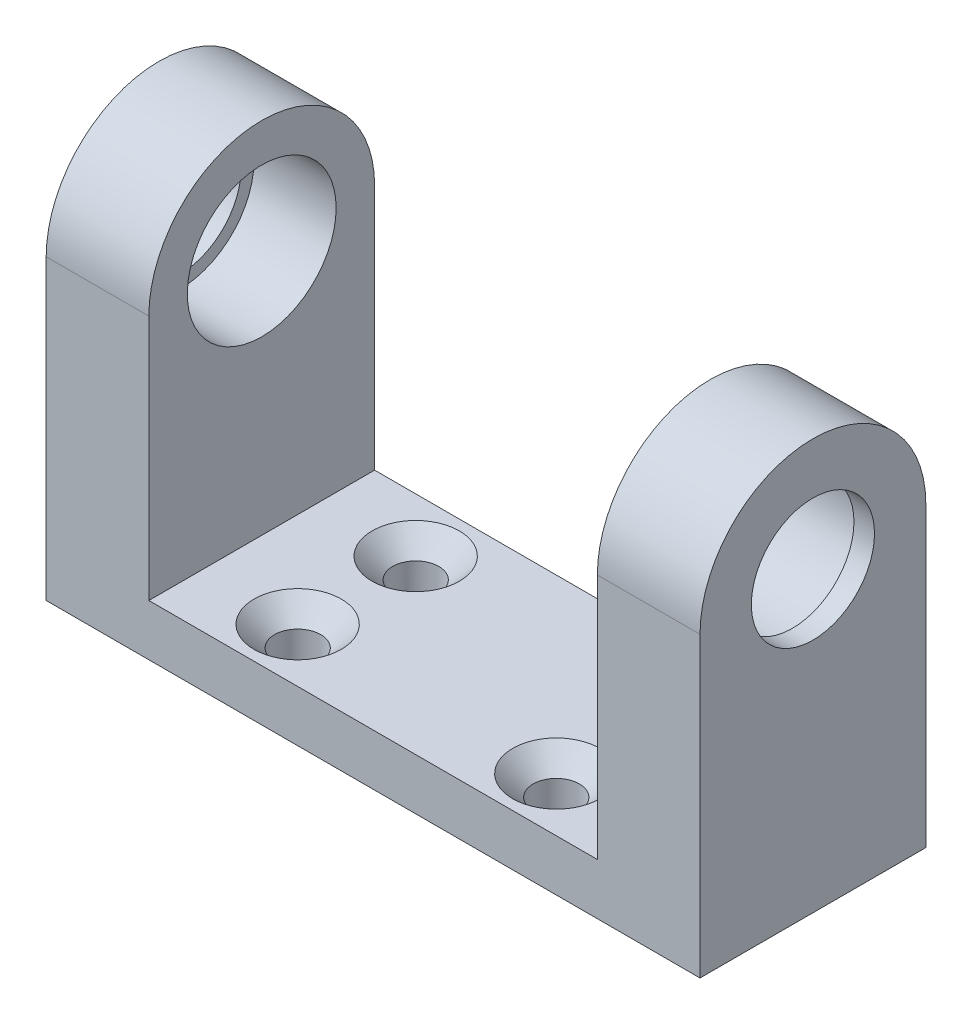
ISO-10303-21;
HEADER;
FILE_DESCRIPTION(('STEP AP214'),'2;1');
FILE_NAME('part.step','',(''),(''),'','','');
FILE_SCHEMA(('AUTOMOTIVE_DESIGN { 1 0 10303 214 1 1 1 1 }'));
ENDSEC;
DATA;
#1=APPLICATION_CONTEXT('core data for automotive mechanical design processes');
#2=APPLICATION_PROTOCOL_DEFINITION('international standard','automotive_design',2000,#1);
#3=PRODUCT_CONTEXT('',#1,'mechanical');
#4=PRODUCT('Part','Part','',(#3));
#5=PRODUCT_RELATED_PRODUCT_CATEGORY('part','',(#4));
#6=PRODUCT_DEFINITION_FORMATION('','',#4);
#7=PRODUCT_DEFINITION_CONTEXT('part definition',#1,'design');
#8=PRODUCT_DEFINITION('design','',#6,#7);
#9=PRODUCT_DEFINITION_SHAPE('','',#8);
#10=(LENGTH_UNIT() NAMED_UNIT(*) SI_UNIT(.MILLI.,.METRE.));
#11=(NAMED_UNIT(*) PLANE_ANGLE_UNIT() SI_UNIT($,.RADIAN.));
#12=(NAMED_UNIT(*) SI_UNIT($,.STERADIAN.) SOLID_ANGLE_UNIT());
#13=UNCERTAINTY_MEASURE_WITH_UNIT(LENGTH_MEASURE(1.E-05),#10,'distance_accuracy_value','');
#14=(GEOMETRIC_REPRESENTATION_CONTEXT(3) GLOBAL_UNCERTAINTY_ASSIGNED_CONTEXT((#13)) GLOBAL_UNIT_ASSIGNED_CONTEXT((#10,
#11,#12)) REPRESENTATION_CONTEXT('',''));
#15=CARTESIAN_POINT('',(0.,0.,0.));
#16=DIRECTION('',(0.,0.,1.));
#17=DIRECTION('',(1.,0.,0.));
#18=AXIS2_PLACEMENT_3D('',#15,#16,#17);
#19=CARTESIAN_POINT('',(-19.25,9.,0.));
#20=DIRECTION('',(1.,0.,0.));
#21=DIRECTION('',(0.,0.,-1.));
#22=AXIS2_PLACEMENT_3D('',#19,#20,#21);
#23=CYLINDRICAL_SURFACE('',#22,6.);
#24=CARTESIAN_POINT('',(-19.25,9.,0.));
#25=DIRECTION('',(1.,0.,0.));
#26=DIRECTION('',(0.,0.,-1.));
#27=AXIS2_PLACEMENT_3D('',#24,#25,#26);
#28=CIRCLE('',#27,6.);
#29=CARTESIAN_POINT('',(-19.25,9.,-6.));
#30=VERTEX_POINT('',#29);
#31=EDGE_CURVE('E233',#30,#30,#28,.T.);
#32=ORIENTED_EDGE('',*,*,#31,.F.);
#33=EDGE_LOOP('',(#32));
#34=FACE_BOUND('',#33,.T.);
#35=CARTESIAN_POINT('',(-17.25,9.,0.));
#36=DIRECTION('',(1.,0.,0.));
#37=DIRECTION('',(0.,0.,-1.));
#38=AXIS2_PLACEMENT_3D('',#35,#36,#37);
#39=CIRCLE('',#38,6.);
#40=CARTESIAN_POINT('',(-17.25,9.,-6.));
#41=VERTEX_POINT('',#40);
#42=EDGE_CURVE('E192',#41,#41,#39,.F.);
#43=ORIENTED_EDGE('',*,*,#42,.F.);
#44=EDGE_LOOP('',(#43));
#45=FACE_BOUND('',#44,.T.);
#46=ADVANCED_FACE('F41',(#34,#45),#23,.F.);
#47=CARTESIAN_POINT('',(0.,0.,11.));
#48=DIRECTION('',(0.,0.,1.));
#49=DIRECTION('',(1.,0.,0.));
#50=AXIS2_PLACEMENT_3D('',#47,#48,#49);
#51=PLANE('',#50);
#52=DIRECTION('',(0.,1.,0.));
#53=VECTOR('',#52,1.);
#54=CARTESIAN_POINT('',(44.45,-20.,11.));
#55=LINE('',#54,#53);
#56=CARTESIAN_POINT('',(44.45,-20.,11.));
#57=VERTEX_POINT('',#56);
#58=CARTESIAN_POINT('',(44.45,9.,11.));
#59=VERTEX_POINT('',#58);
#60=EDGE_CURVE('E138',#57,#59,#55,.T.);
#61=ORIENTED_EDGE('',*,*,#60,.T.);
#62=DIRECTION('',(1.,0.,0.));
#63=VECTOR('',#62,1.);
#64=CARTESIAN_POINT('',(-19.25,9.,11.));
#65=LINE('',#64,#63);
#66=CARTESIAN_POINT('',(34.45,9.,11.));
#67=VERTEX_POINT('',#66);
#68=EDGE_CURVE('E116',#67,#59,#65,.T.);
#69=ORIENTED_EDGE('',*,*,#68,.F.);
#70=DIRECTION('',(0.,-1.,0.));
#71=VECTOR('',#70,1.);
#72=CARTESIAN_POINT('',(34.45,20.,11.));
#73=LINE('',#72,#71);
#74=CARTESIAN_POINT('',(34.45,-15.,11.));
#75=VERTEX_POINT('',#74);
#76=EDGE_CURVE('E249',#67,#75,#73,.T.);
#77=ORIENTED_EDGE('',*,*,#76,.T.);
#78=DIRECTION('',(-1.,0.,0.));
#79=VECTOR('',#78,1.);
#80=CARTESIAN_POINT('',(34.45,-15.,11.));
#81=LINE('',#80,#79);
#82=CARTESIAN_POINT('',(-9.25000000000001,-15.,11.));
#83=VERTEX_POINT('',#82);
#84=EDGE_CURVE('E252',#75,#83,#81,.T.);
#85=ORIENTED_EDGE('',*,*,#84,.T.);
#86=DIRECTION('',(0.,1.,0.));
#87=VECTOR('',#86,1.);
#88=CARTESIAN_POINT('',(-9.25000000000001,-15.,11.));
#89=LINE('',#88,#87);
#90=CARTESIAN_POINT('',(-9.25000000000001,9.,11.));
#91=VERTEX_POINT('',#90);
#92=EDGE_CURVE('E255',#83,#91,#89,.T.);
#93=ORIENTED_EDGE('',*,*,#92,.T.);
#94=CARTESIAN_POINT('',(-19.25,9.,11.));
#95=VERTEX_POINT('',#94);
#96=EDGE_CURVE('E229',#95,#91,#65,.T.);
#97=ORIENTED_EDGE('',*,*,#96,.F.);
#98=DIRECTION('',(0.,-1.,0.));
#99=VECTOR('',#98,1.);
#100=CARTESIAN_POINT('',(-19.25,20.,11.));
#101=LINE('',#100,#99);
#102=CARTESIAN_POINT('',(-19.25,-20.,11.));
#103=VERTEX_POINT('',#102);
#104=EDGE_CURVE('E124',#95,#103,#101,.T.);
#105=ORIENTED_EDGE('',*,*,#104,.T.);
#106=DIRECTION('',(1.,0.,0.));
#107=VECTOR('',#106,1.);
#108=CARTESIAN_POINT('',(-19.25,-20.,11.));
#109=LINE('',#108,#107);
#110=EDGE_CURVE('E132',#103,#57,#109,.T.);
#111=ORIENTED_EDGE('',*,*,#110,.T.);
#112=EDGE_LOOP('',(#61,#69,#77,#85,#93,#97,#105,#111));
#113=FACE_BOUND('',#112,.T.);
#114=ADVANCED_FACE('F281',(#113),#51,.T.);
#115=CARTESIAN_POINT('',(0.,0.,-11.));
#116=DIRECTION('',(0.,0.,1.));
#117=DIRECTION('',(1.,0.,0.));
#118=AXIS2_PLACEMENT_3D('',#115,#116,#117);
#119=PLANE('',#118);
#120=DIRECTION('',(1.,0.,0.));
#121=VECTOR('',#120,1.);
#122=CARTESIAN_POINT('',(-19.25,9.,-11.));
#123=LINE('',#122,#121);
#124=CARTESIAN_POINT('',(44.45,8.99999999999999,-11.));
#125=VERTEX_POINT('',#124);
#126=CARTESIAN_POINT('',(34.45,9.,-11.));
#127=VERTEX_POINT('',#126);
#128=EDGE_CURVE('E159',#125,#127,#123,.F.);
#129=ORIENTED_EDGE('',*,*,#128,.F.);
#130=DIRECTION('',(0.,1.,0.));
#131=VECTOR('',#130,1.);
#132=CARTESIAN_POINT('',(44.45,-20.,-11.));
#133=LINE('',#132,#131);
#134=CARTESIAN_POINT('',(44.45,-20.,-11.));
#135=VERTEX_POINT('',#134);
#136=EDGE_CURVE('E263',#135,#125,#133,.T.);
#137=ORIENTED_EDGE('',*,*,#136,.F.);
#138=DIRECTION('',(1.,0.,0.));
#139=VECTOR('',#138,1.);
#140=CARTESIAN_POINT('',(-19.25,-20.,-11.));
#141=LINE('',#140,#139);
#142=CARTESIAN_POINT('',(-19.25,-20.,-11.));
#143=VERTEX_POINT('',#142);
#144=EDGE_CURVE('E130',#143,#135,#141,.T.);
#145=ORIENTED_EDGE('',*,*,#144,.F.);
#146=DIRECTION('',(0.,-1.,0.));
#147=VECTOR('',#146,1.);
#148=CARTESIAN_POINT('',(-19.25,20.,-11.));
#149=LINE('',#148,#147);
#150=CARTESIAN_POINT('',(-19.25,9.,-11.));
#151=VERTEX_POINT('',#150);
#152=EDGE_CURVE('E122',#151,#143,#149,.T.);
#153=ORIENTED_EDGE('',*,*,#152,.F.);
#154=DIRECTION('',(1.,0.,0.));
#155=VECTOR('',#154,1.);
#156=CARTESIAN_POINT('',(-19.25,9.,-11.));
#157=LINE('',#156,#155);
#158=CARTESIAN_POINT('',(-9.25000000000001,9.,-11.));
#159=VERTEX_POINT('',#158);
#160=EDGE_CURVE('E106',#151,#159,#157,.T.);
#161=ORIENTED_EDGE('',*,*,#160,.T.);
#162=DIRECTION('',(0.,1.,0.));
#163=VECTOR('',#162,1.);
#164=CARTESIAN_POINT('',(-9.25000000000001,-15.,-11.));
#165=LINE('',#164,#163);
#166=CARTESIAN_POINT('',(-9.25000000000001,-15.,-11.));
#167=VERTEX_POINT('',#166);
#168=EDGE_CURVE('E133',#167,#159,#165,.T.);
#169=ORIENTED_EDGE('',*,*,#168,.F.);
#170=DIRECTION('',(-1.,0.,0.));
#171=VECTOR('',#170,1.);
#172=CARTESIAN_POINT('',(34.45,-15.,-11.));
#173=LINE('',#172,#171);
#174=CARTESIAN_POINT('',(34.45,-15.,-11.));
#175=VERTEX_POINT('',#174);
#176=EDGE_CURVE('E140',#175,#167,#173,.T.);
#177=ORIENTED_EDGE('',*,*,#176,.F.);
#178=DIRECTION('',(0.,-1.,0.));
#179=VECTOR('',#178,1.);
#180=CARTESIAN_POINT('',(34.45,20.,-11.));
#181=LINE('',#180,#179);
#182=EDGE_CURVE('E267',#127,#175,#181,.T.);
#183=ORIENTED_EDGE('',*,*,#182,.F.);
#184=EDGE_LOOP('',(#129,#137,#145,#153,#161,#169,#177,#183));
#185=FACE_BOUND('',#184,.T.);
#186=ADVANCED_FACE('F128',(#185),#119,.F.);
#187=CARTESIAN_POINT('',(-19.25,-20.,11.));
#188=DIRECTION('',(0.,1.,0.));
#189=DIRECTION('',(0.,0.,1.));
#190=AXIS2_PLACEMENT_3D('',#187,#188,#189);
#191=PLANE('',#190);
#192=CARTESIAN_POINT('',(0.,-20.,5.75));
#193=DIRECTION('',(0.,1.,0.));
#194=DIRECTION('',(0.,0.,1.));
#195=AXIS2_PLACEMENT_3D('',#192,#193,#194);
#196=CIRCLE('',#195,2.25);
#197=CARTESIAN_POINT('',(0.,-20.,8.));
#198=VERTEX_POINT('',#197);
#199=EDGE_CURVE('E216',#198,#198,#196,.T.);
#200=ORIENTED_EDGE('',*,*,#199,.T.);
#201=EDGE_LOOP('',(#200));
#202=FACE_BOUND('',#201,.T.);
#203=CARTESIAN_POINT('',(25.2,-20.,-5.75));
#204=DIRECTION('',(0.,1.,0.));
#205=DIRECTION('',(0.,0.,1.));
#206=AXIS2_PLACEMENT_3D('',#203,#204,#205);
#207=CIRCLE('',#206,2.25);
#208=CARTESIAN_POINT('',(25.2,-20.,-3.5));
#209=VERTEX_POINT('',#208);
#210=EDGE_CURVE('E211',#209,#209,#207,.T.);
#211=ORIENTED_EDGE('',*,*,#210,.T.);
#212=EDGE_LOOP('',(#211));
#213=FACE_BOUND('',#212,.T.);
#214=CARTESIAN_POINT('',(25.2,-20.,5.75));
#215=DIRECTION('',(0.,1.,0.));
#216=DIRECTION('',(0.,0.,1.));
#217=AXIS2_PLACEMENT_3D('',#214,#215,#216);
#218=CIRCLE('',#217,2.25);
#219=CARTESIAN_POINT('',(25.2,-20.,8.));
#220=VERTEX_POINT('',#219);
#221=EDGE_CURVE('E205',#220,#220,#218,.T.);
#222=ORIENTED_EDGE('',*,*,#221,.T.);
#223=EDGE_LOOP('',(#222));
#224=FACE_BOUND('',#223,.T.);
#225=CARTESIAN_POINT('',(0.,-20.,-5.75));
#226=DIRECTION('',(0.,1.,0.));
#227=DIRECTION('',(0.,0.,1.));
#228=AXIS2_PLACEMENT_3D('',#225,#226,#227);
#229=CIRCLE('',#228,2.25);
#230=CARTESIAN_POINT('',(0.,-20.,-3.5));
#231=VERTEX_POINT('',#230);
#232=EDGE_CURVE('E220',#231,#231,#229,.T.);
#233=ORIENTED_EDGE('',*,*,#232,.T.);
#234=EDGE_LOOP('',(#233));
#235=FACE_BOUND('',#234,.T.);
#236=ORIENTED_EDGE('',*,*,#144,.T.);
#237=DIRECTION('',(0.,0.,-1.));
#238=VECTOR('',#237,1.);
#239=CARTESIAN_POINT('',(44.45,-20.,11.));
#240=LINE('',#239,#238);
#241=EDGE_CURVE('E155',#57,#135,#240,.T.);
#242=ORIENTED_EDGE('',*,*,#241,.F.);
#243=ORIENTED_EDGE('',*,*,#110,.F.);
#244=DIRECTION('',(0.,0.,-1.));
#245=VECTOR('',#244,1.);
#246=CARTESIAN_POINT('',(-19.25,-20.,11.));
#247=LINE('',#246,#245);
#248=EDGE_CURVE('E144',#103,#143,#247,.T.);
#249=ORIENTED_EDGE('',*,*,#248,.T.);
#250=EDGE_LOOP('',(#236,#242,#243,#249));
#251=FACE_BOUND('',#250,.T.);
#252=ADVANCED_FACE('F291',(#202,#213,#224,#235,#251),#191,.F.);
#253=CARTESIAN_POINT('',(44.45,-20.,11.));
#254=DIRECTION('',(-1.,0.,0.));
#255=DIRECTION('',(0.,0.,1.));
#256=AXIS2_PLACEMENT_3D('',#253,#254,#255);
#257=PLANE('',#256);
#258=CARTESIAN_POINT('',(44.45,9.,0.));
#259=DIRECTION('',(1.,0.,0.));
#260=DIRECTION('',(0.,0.,-1.));
#261=AXIS2_PLACEMENT_3D('',#258,#259,#260);
#262=CIRCLE('',#261,6.);
#263=CARTESIAN_POINT('',(44.45,9.,-6.));
#264=VERTEX_POINT('',#263);
#265=EDGE_CURVE('E231',#264,#264,#262,.T.);
#266=ORIENTED_EDGE('',*,*,#265,.F.);
#267=EDGE_LOOP('',(#266));
#268=FACE_BOUND('',#267,.T.);
#269=ORIENTED_EDGE('',*,*,#136,.T.);
#270=CARTESIAN_POINT('',(44.45,9.,0.));
#271=DIRECTION('',(-1.,0.,0.));
#272=DIRECTION('',(0.,0.,-1.));
#273=AXIS2_PLACEMENT_3D('',#270,#271,#272);
#274=CIRCLE('',#273,11.);
#275=EDGE_CURVE('E59',#59,#125,#274,.T.);
#276=ORIENTED_EDGE('',*,*,#275,.F.);
#277=ORIENTED_EDGE('',*,*,#60,.F.);
#278=ORIENTED_EDGE('',*,*,#241,.T.);
#279=EDGE_LOOP('',(#269,#276,#277,#278));
#280=FACE_BOUND('',#279,.T.);
#281=ADVANCED_FACE('F287',(#268,#280),#257,.F.);
#282=CARTESIAN_POINT('',(34.45,20.,11.));
#283=DIRECTION('',(1.,0.,0.));
#284=DIRECTION('',(0.,0.,-1.));
#285=AXIS2_PLACEMENT_3D('',#282,#283,#284);
#286=PLANE('',#285);
#287=CARTESIAN_POINT('',(34.45,9.,0.));
#288=DIRECTION('',(1.,0.,0.));
#289=DIRECTION('',(0.,0.,-1.));
#290=AXIS2_PLACEMENT_3D('',#287,#288,#289);
#291=CIRCLE('',#290,7.25);
#292=CARTESIAN_POINT('',(34.45,9.,-7.25));
#293=VERTEX_POINT('',#292);
#294=EDGE_CURVE('E200',#293,#293,#291,.T.);
#295=ORIENTED_EDGE('',*,*,#294,.T.);
#296=EDGE_LOOP('',(#295));
#297=FACE_BOUND('',#296,.T.);
#298=ORIENTED_EDGE('',*,*,#76,.F.);
#299=CARTESIAN_POINT('',(34.45,9.,0.));
#300=DIRECTION('',(1.,0.,0.));
#301=DIRECTION('',(0.,0.,-1.));
#302=AXIS2_PLACEMENT_3D('',#299,#300,#301);
#303=CIRCLE('',#302,11.);
#304=EDGE_CURVE('E242',#67,#127,#303,.F.);
#305=ORIENTED_EDGE('',*,*,#304,.T.);
#306=ORIENTED_EDGE('',*,*,#182,.T.);
#307=DIRECTION('',(0.,0.,-1.));
#308=VECTOR('',#307,1.);
#309=CARTESIAN_POINT('',(34.45,-15.,11.));
#310=LINE('',#309,#308);
#311=EDGE_CURVE('E151',#75,#175,#310,.T.);
#312=ORIENTED_EDGE('',*,*,#311,.F.);
#313=EDGE_LOOP('',(#298,#305,#306,#312));
#314=FACE_BOUND('',#313,.T.);
#315=ADVANCED_FACE('F285',(#297,#314),#286,.F.);
#316=CARTESIAN_POINT('',(34.45,-15.,11.));
#317=DIRECTION('',(0.,-1.,0.));
#318=DIRECTION('',(1.,0.,0.));
#319=AXIS2_PLACEMENT_3D('',#316,#317,#318);
#320=PLANE('',#319);
#321=CARTESIAN_POINT('',(25.2,-15.,-5.75));
#322=DIRECTION('',(0.,-1.,0.));
#323=DIRECTION('',(1.,0.,0.));
#324=AXIS2_PLACEMENT_3D('',#321,#322,#323);
#325=CIRCLE('',#324,4.25);
#326=CARTESIAN_POINT('',(29.45,-15.,-5.75));
#327=VERTEX_POINT('',#326);
#328=EDGE_CURVE('E178',#327,#327,#325,.T.);
#329=ORIENTED_EDGE('',*,*,#328,.T.);
#330=EDGE_LOOP('',(#329));
#331=FACE_BOUND('',#330,.T.);
#332=CARTESIAN_POINT('',(25.2,-15.,5.75));
#333=DIRECTION('',(0.,-1.,0.));
#334=DIRECTION('',(1.,0.,0.));
#335=AXIS2_PLACEMENT_3D('',#332,#333,#334);
#336=CIRCLE('',#335,4.25);
#337=CARTESIAN_POINT('',(29.45,-15.,5.75));
#338=VERTEX_POINT('',#337);
#339=EDGE_CURVE('E174',#338,#338,#336,.T.);
#340=ORIENTED_EDGE('',*,*,#339,.T.);
#341=EDGE_LOOP('',(#340));
#342=FACE_BOUND('',#341,.T.);
#343=CARTESIAN_POINT('',(0.,-15.,-5.75));
#344=DIRECTION('',(0.,-1.,0.));
#345=DIRECTION('',(1.,0.,0.));
#346=AXIS2_PLACEMENT_3D('',#343,#344,#345);
#347=CIRCLE('',#346,4.25000000000001);
#348=CARTESIAN_POINT('',(4.25000000000001,-15.,-5.75));
#349=VERTEX_POINT('',#348);
#350=EDGE_CURVE('E170',#349,#349,#347,.T.);
#351=ORIENTED_EDGE('',*,*,#350,.T.);
#352=EDGE_LOOP('',(#351));
#353=FACE_BOUND('',#352,.T.);
#354=CARTESIAN_POINT('',(0.,-15.,5.75));
#355=DIRECTION('',(0.,-1.,0.));
#356=DIRECTION('',(1.,0.,0.));
#357=AXIS2_PLACEMENT_3D('',#354,#355,#356);
#358=CIRCLE('',#357,4.25000000000002);
#359=CARTESIAN_POINT('',(4.25000000000002,-15.,5.75));
#360=VERTEX_POINT('',#359);
#361=EDGE_CURVE('E166',#360,#360,#358,.T.);
#362=ORIENTED_EDGE('',*,*,#361,.T.);
#363=EDGE_LOOP('',(#362));
#364=FACE_BOUND('',#363,.T.);
#365=ORIENTED_EDGE('',*,*,#176,.T.);
#366=DIRECTION('',(0.,0.,-1.));
#367=VECTOR('',#366,1.);
#368=CARTESIAN_POINT('',(-9.25000000000001,-15.,11.));
#369=LINE('',#368,#367);
#370=EDGE_CURVE('E147',#83,#167,#369,.T.);
#371=ORIENTED_EDGE('',*,*,#370,.F.);
#372=ORIENTED_EDGE('',*,*,#84,.F.);
#373=ORIENTED_EDGE('',*,*,#311,.T.);
#374=EDGE_LOOP('',(#365,#371,#372,#373));
#375=FACE_BOUND('',#374,.T.);
#376=ADVANCED_FACE('F273',(#331,#342,#353,#364,#375),#320,.F.);
#377=CARTESIAN_POINT('',(-9.25000000000001,-15.,11.));
#378=DIRECTION('',(-1.,0.,0.));
#379=DIRECTION('',(0.,-1.,0.));
#380=AXIS2_PLACEMENT_3D('',#377,#378,#379);
#381=PLANE('',#380);
#382=CARTESIAN_POINT('',(-9.25000000000001,9.,0.));
#383=DIRECTION('',(-1.,0.,0.));
#384=DIRECTION('',(0.,-1.,0.));
#385=AXIS2_PLACEMENT_3D('',#382,#383,#384);
#386=CIRCLE('',#385,7.25);
#387=CARTESIAN_POINT('',(-9.25000000000001,1.75,0.));
#388=VERTEX_POINT('',#387);
#389=EDGE_CURVE('E45',#388,#388,#386,.T.);
#390=ORIENTED_EDGE('',*,*,#389,.T.);
#391=EDGE_LOOP('',(#390));
#392=FACE_BOUND('',#391,.T.);
#393=ORIENTED_EDGE('',*,*,#168,.T.);
#394=CARTESIAN_POINT('',(-9.25000000000001,9.,0.));
#395=DIRECTION('',(-1.,0.,0.));
#396=DIRECTION('',(0.,-1.,0.));
#397=AXIS2_PLACEMENT_3D('',#394,#395,#396);
#398=CIRCLE('',#397,11.);
#399=EDGE_CURVE('E67',#159,#91,#398,.F.);
#400=ORIENTED_EDGE('',*,*,#399,.T.);
#401=ORIENTED_EDGE('',*,*,#92,.F.);
#402=ORIENTED_EDGE('',*,*,#370,.T.);
#403=EDGE_LOOP('',(#393,#400,#401,#402));
#404=FACE_BOUND('',#403,.T.);
#405=ADVANCED_FACE('F279',(#392,#404),#381,.F.);
#406=CARTESIAN_POINT('',(-19.25,20.,11.));
#407=DIRECTION('',(1.,0.,0.));
#408=DIRECTION('',(0.,0.,-1.));
#409=AXIS2_PLACEMENT_3D('',#406,#407,#408);
#410=PLANE('',#409);
#411=ORIENTED_EDGE('',*,*,#31,.T.);
#412=EDGE_LOOP('',(#411));
#413=FACE_BOUND('',#412,.T.);
#414=ORIENTED_EDGE('',*,*,#104,.F.);
#415=CARTESIAN_POINT('',(-19.25,9.,0.));
#416=DIRECTION('',(-1.,0.,0.));
#417=DIRECTION('',(0.,0.,1.));
#418=AXIS2_PLACEMENT_3D('',#415,#416,#417);
#419=CIRCLE('',#418,11.);
#420=EDGE_CURVE('E109',#95,#151,#419,.T.);
#421=ORIENTED_EDGE('',*,*,#420,.T.);
#422=ORIENTED_EDGE('',*,*,#152,.T.);
#423=ORIENTED_EDGE('',*,*,#248,.F.);
#424=EDGE_LOOP('',(#414,#421,#422,#423));
#425=FACE_BOUND('',#424,.T.);
#426=ADVANCED_FACE('F120',(#413,#425),#410,.F.);
#427=CARTESIAN_POINT('',(-19.25,9.,0.));
#428=DIRECTION('',(1.,0.,0.));
#429=DIRECTION('',(0.,0.,-1.));
#430=AXIS2_PLACEMENT_3D('',#427,#428,#429);
#431=CYLINDRICAL_SURFACE('',#430,11.);
#432=ORIENTED_EDGE('',*,*,#160,.F.);
#433=ORIENTED_EDGE('',*,*,#420,.F.);
#434=ORIENTED_EDGE('',*,*,#96,.T.);
#435=ORIENTED_EDGE('',*,*,#399,.F.);
#436=EDGE_LOOP('',(#432,#433,#434,#435));
#437=FACE_BOUND('',#436,.T.);
#438=ADVANCED_FACE('F108',(#437),#431,.T.);
#439=ORIENTED_EDGE('',*,*,#275,.T.);
#440=ORIENTED_EDGE('',*,*,#128,.T.);
#441=ORIENTED_EDGE('',*,*,#304,.F.);
#442=ORIENTED_EDGE('',*,*,#68,.T.);
#443=EDGE_LOOP('',(#439,#440,#441,#442));
#444=FACE_BOUND('',#443,.T.);
#445=ADVANCED_FACE('F317',(#444),#431,.T.);
#446=CARTESIAN_POINT('',(42.45,9.,0.));
#447=DIRECTION('',(1.,0.,0.));
#448=DIRECTION('',(0.,0.,-1.));
#449=AXIS2_PLACEMENT_3D('',#446,#447,#448);
#450=CIRCLE('',#449,6.);
#451=CARTESIAN_POINT('',(42.45,9.,-6.));
#452=VERTEX_POINT('',#451);
#453=EDGE_CURVE('E189',#452,#452,#450,.F.);
#454=ORIENTED_EDGE('',*,*,#453,.T.);
#455=EDGE_LOOP('',(#454));
#456=FACE_BOUND('',#455,.T.);
#457=ORIENTED_EDGE('',*,*,#265,.T.);
#458=EDGE_LOOP('',(#457));
#459=FACE_BOUND('',#458,.T.);
#460=ADVANCED_FACE('F307',(#456,#459),#23,.F.);
#461=CARTESIAN_POINT('',(0.,-20.,-5.75));
#462=DIRECTION('',(0.,1.,0.));
#463=DIRECTION('',(0.,0.,1.));
#464=AXIS2_PLACEMENT_3D('',#461,#462,#463);
#465=CYLINDRICAL_SURFACE('',#464,2.25);
#466=CARTESIAN_POINT('',(0.,-17.,-5.75));
#467=DIRECTION('',(0.,-1.,0.));
#468=DIRECTION('',(0.,0.,-1.));
#469=AXIS2_PLACEMENT_3D('',#466,#467,#468);
#470=CIRCLE('',#469,2.25);
#471=CARTESIAN_POINT('',(0.,-17.,-8.));
#472=VERTEX_POINT('',#471);
#473=EDGE_CURVE('E51',#472,#472,#470,.F.);
#474=ORIENTED_EDGE('',*,*,#473,.T.);
#475=EDGE_LOOP('',(#474));
#476=FACE_BOUND('',#475,.T.);
#477=ORIENTED_EDGE('',*,*,#232,.F.);
#478=EDGE_LOOP('',(#477));
#479=FACE_BOUND('',#478,.T.);
#480=ADVANCED_FACE('F316',(#476,#479),#465,.F.);
#481=CARTESIAN_POINT('',(25.2,-20.,5.75));
#482=DIRECTION('',(0.,1.,0.));
#483=DIRECTION('',(0.,0.,1.));
#484=AXIS2_PLACEMENT_3D('',#481,#482,#483);
#485=CYLINDRICAL_SURFACE('',#484,2.25);
#486=CARTESIAN_POINT('',(25.2,-17.,5.75));
#487=DIRECTION('',(0.,-1.,0.));
#488=DIRECTION('',(0.,0.,-1.));
#489=AXIS2_PLACEMENT_3D('',#486,#487,#488);
#490=CIRCLE('',#489,2.25);
#491=CARTESIAN_POINT('',(25.2,-17.,3.5));
#492=VERTEX_POINT('',#491);
#493=EDGE_CURVE('E182',#492,#492,#490,.F.);
#494=ORIENTED_EDGE('',*,*,#493,.T.);
#495=EDGE_LOOP('',(#494));
#496=FACE_BOUND('',#495,.T.);
#497=ORIENTED_EDGE('',*,*,#221,.F.);
#498=EDGE_LOOP('',(#497));
#499=FACE_BOUND('',#498,.T.);
#500=ADVANCED_FACE('F323',(#496,#499),#485,.F.);
#501=CARTESIAN_POINT('',(25.2,-20.,-5.75));
#502=DIRECTION('',(0.,1.,0.));
#503=DIRECTION('',(0.,0.,1.));
#504=AXIS2_PLACEMENT_3D('',#501,#502,#503);
#505=CYLINDRICAL_SURFACE('',#504,2.25);
#506=CARTESIAN_POINT('',(25.2,-17.,-5.75));
#507=DIRECTION('',(0.,-1.,0.));
#508=DIRECTION('',(0.,0.,-1.));
#509=AXIS2_PLACEMENT_3D('',#506,#507,#508);
#510=CIRCLE('',#509,2.25);
#511=CARTESIAN_POINT('',(25.2,-17.,-8.));
#512=VERTEX_POINT('',#511);
#513=EDGE_CURVE('E162',#512,#512,#510,.F.);
#514=ORIENTED_EDGE('',*,*,#513,.T.);
#515=EDGE_LOOP('',(#514));
#516=FACE_BOUND('',#515,.T.);
#517=ORIENTED_EDGE('',*,*,#210,.F.);
#518=EDGE_LOOP('',(#517));
#519=FACE_BOUND('',#518,.T.);
#520=ADVANCED_FACE('F350',(#516,#519),#505,.F.);
#521=CARTESIAN_POINT('',(0.,-20.,5.75));
#522=DIRECTION('',(0.,1.,0.));
#523=DIRECTION('',(0.,0.,1.));
#524=AXIS2_PLACEMENT_3D('',#521,#522,#523);
#525=CYLINDRICAL_SURFACE('',#524,2.25);
#526=CARTESIAN_POINT('',(0.,-17.,5.75));
#527=DIRECTION('',(0.,-1.,0.));
#528=DIRECTION('',(0.,0.,-1.));
#529=AXIS2_PLACEMENT_3D('',#526,#527,#528);
#530=CIRCLE('',#529,2.25);
#531=CARTESIAN_POINT('',(0.,-17.,3.5));
#532=VERTEX_POINT('',#531);
#533=EDGE_CURVE('E12',#532,#532,#530,.F.);
#534=ORIENTED_EDGE('',*,*,#533,.T.);
#535=EDGE_LOOP('',(#534));
#536=FACE_BOUND('',#535,.T.);
#537=ORIENTED_EDGE('',*,*,#199,.F.);
#538=EDGE_LOOP('',(#537));
#539=FACE_BOUND('',#538,.T.);
#540=ADVANCED_FACE('F352',(#536,#539),#525,.F.);
#541=CARTESIAN_POINT('',(25.2,-17.,-5.75));
#542=DIRECTION('',(0.,1.,0.));
#543=DIRECTION('',(0.,0.,1.));
#544=AXIS2_PLACEMENT_3D('',#541,#542,#543);
#545=CONICAL_SURFACE('',#544,2.25,0.78539816339745);
#546=ORIENTED_EDGE('',*,*,#328,.F.);
#547=EDGE_LOOP('',(#546));
#548=FACE_BOUND('',#547,.T.);
#549=ORIENTED_EDGE('',*,*,#513,.F.);
#550=EDGE_LOOP('',(#549));
#551=FACE_BOUND('',#550,.T.);
#552=ADVANCED_FACE('F355',(#548,#551),#545,.F.);
#553=CARTESIAN_POINT('',(25.2,-17.,5.75));
#554=DIRECTION('',(0.,1.,0.));
#555=DIRECTION('',(0.,0.,1.));
#556=AXIS2_PLACEMENT_3D('',#553,#554,#555);
#557=CONICAL_SURFACE('',#556,2.25,0.78539816339745);
#558=ORIENTED_EDGE('',*,*,#339,.F.);
#559=EDGE_LOOP('',(#558));
#560=FACE_BOUND('',#559,.T.);
#561=ORIENTED_EDGE('',*,*,#493,.F.);
#562=EDGE_LOOP('',(#561));
#563=FACE_BOUND('',#562,.T.);
#564=ADVANCED_FACE('F372',(#560,#563),#557,.F.);
#565=CARTESIAN_POINT('',(0.,-17.,-5.75));
#566=DIRECTION('',(0.,1.,0.));
#567=DIRECTION('',(0.,0.,1.));
#568=AXIS2_PLACEMENT_3D('',#565,#566,#567);
#569=CONICAL_SURFACE('',#568,2.25,0.78539816339745);
#570=ORIENTED_EDGE('',*,*,#350,.F.);
#571=EDGE_LOOP('',(#570));
#572=FACE_BOUND('',#571,.T.);
#573=ORIENTED_EDGE('',*,*,#473,.F.);
#574=EDGE_LOOP('',(#573));
#575=FACE_BOUND('',#574,.T.);
#576=ADVANCED_FACE('F342',(#572,#575),#569,.F.);
#577=CARTESIAN_POINT('',(0.,-17.,5.75));
#578=DIRECTION('',(0.,1.,0.));
#579=DIRECTION('',(0.,0.,1.));
#580=AXIS2_PLACEMENT_3D('',#577,#578,#579);
#581=CONICAL_SURFACE('',#580,2.25,0.78539816339745);
#582=ORIENTED_EDGE('',*,*,#361,.F.);
#583=EDGE_LOOP('',(#582));
#584=FACE_BOUND('',#583,.T.);
#585=ORIENTED_EDGE('',*,*,#533,.F.);
#586=EDGE_LOOP('',(#585));
#587=FACE_BOUND('',#586,.T.);
#588=ADVANCED_FACE('F43',(#584,#587),#581,.F.);
#589=CARTESIAN_POINT('',(42.45,9.,0.));
#590=DIRECTION('',(1.,0.,0.));
#591=DIRECTION('',(0.,0.,-1.));
#592=AXIS2_PLACEMENT_3D('',#589,#590,#591);
#593=PLANE('',#592);
#594=CARTESIAN_POINT('',(42.45,9.,0.));
#595=DIRECTION('',(1.,0.,0.));
#596=DIRECTION('',(0.,0.,-1.));
#597=AXIS2_PLACEMENT_3D('',#594,#595,#596);
#598=CIRCLE('',#597,7.25);
#599=CARTESIAN_POINT('',(42.45,9.,-7.25));
#600=VERTEX_POINT('',#599);
#601=EDGE_CURVE('E522',#600,#600,#598,.T.);
#602=ORIENTED_EDGE('',*,*,#601,.F.);
#603=EDGE_LOOP('',(#602));
#604=FACE_BOUND('',#603,.T.);
#605=ORIENTED_EDGE('',*,*,#453,.F.);
#606=EDGE_LOOP('',(#605));
#607=FACE_BOUND('',#606,.T.);
#608=ADVANCED_FACE('F330',(#604,#607),#593,.F.);
#609=CARTESIAN_POINT('',(-39.7560966544099,9.,0.));
#610=DIRECTION('',(1.,0.,0.));
#611=DIRECTION('',(0.,0.,-1.));
#612=AXIS2_PLACEMENT_3D('',#609,#610,#611);
#613=CYLINDRICAL_SURFACE('',#612,7.25);
#614=ORIENTED_EDGE('',*,*,#601,.T.);
#615=EDGE_LOOP('',(#614));
#616=FACE_BOUND('',#615,.T.);
#617=ORIENTED_EDGE('',*,*,#294,.F.);
#618=EDGE_LOOP('',(#617));
#619=FACE_BOUND('',#618,.T.);
#620=ADVANCED_FACE('F332',(#616,#619),#613,.F.);
#621=CARTESIAN_POINT('',(-17.25,9.,0.));
#622=DIRECTION('',(1.,0.,0.));
#623=DIRECTION('',(0.,0.,-1.));
#624=AXIS2_PLACEMENT_3D('',#621,#622,#623);
#625=CIRCLE('',#624,7.25);
#626=CARTESIAN_POINT('',(-17.25,9.,-7.25));
#627=VERTEX_POINT('',#626);
#628=EDGE_CURVE('E193',#627,#627,#625,.F.);
#629=ORIENTED_EDGE('',*,*,#628,.T.);
#630=EDGE_LOOP('',(#629));
#631=FACE_BOUND('',#630,.T.);
#632=ORIENTED_EDGE('',*,*,#389,.F.);
#633=EDGE_LOOP('',(#632));
#634=FACE_BOUND('',#633,.T.);
#635=ADVANCED_FACE('F339',(#631,#634),#613,.F.);
#636=CARTESIAN_POINT('',(-17.25,20.,11.));
#637=DIRECTION('',(1.,0.,0.));
#638=DIRECTION('',(0.,0.,-1.));
#639=AXIS2_PLACEMENT_3D('',#636,#637,#638);
#640=PLANE('',#639);
#641=ORIENTED_EDGE('',*,*,#628,.F.);
#642=EDGE_LOOP('',(#641));
#643=FACE_BOUND('',#642,.T.);
#644=ORIENTED_EDGE('',*,*,#42,.T.);
#645=EDGE_LOOP('',(#644));
#646=FACE_BOUND('',#645,.T.);
#647=ADVANCED_FACE('F346',(#643,#646),#640,.T.);
#648=CLOSED_SHELL('',(#46,#114,#186,#252,#281,#315,#376,#405,#426,#438,#445,#460,#480,#500,#520,
#540,#552,#564,#576,#588,#608,#620,#635,#647));
#649=MANIFOLD_SOLID_BREP('B2',#648);
#650=ADVANCED_BREP_SHAPE_REPRESENTATION('',(#18,#649),#14);
#651=SHAPE_DEFINITION_REPRESENTATION(#9,#650);
ENDSEC;
END-ISO-10303-21;
